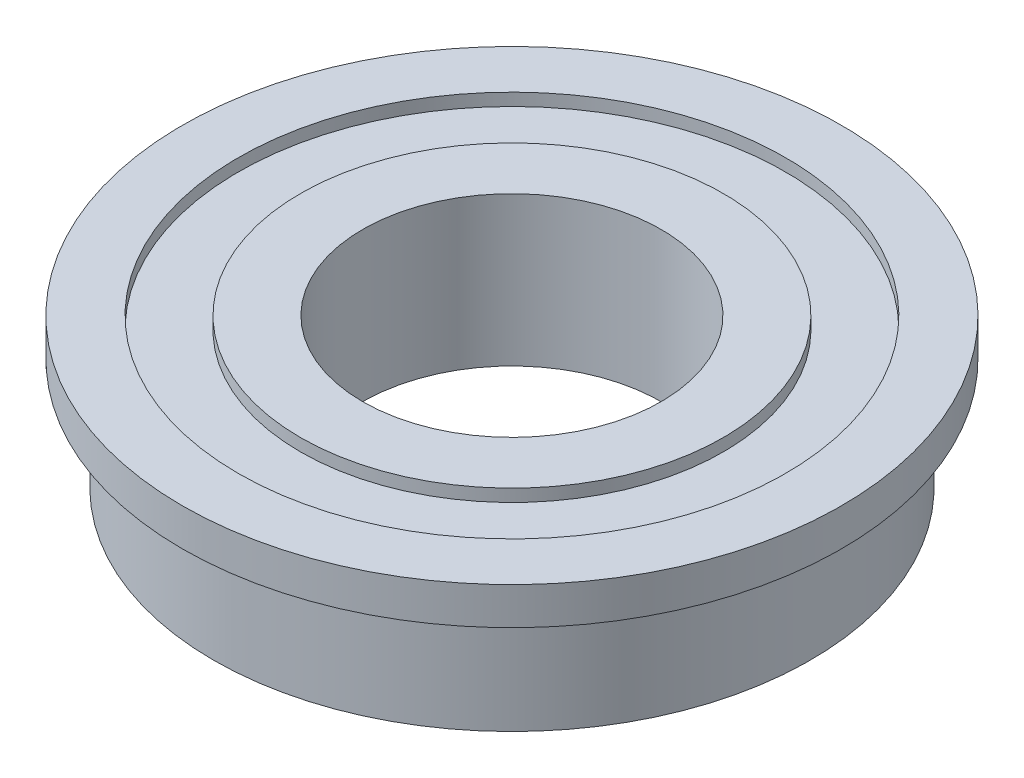
ISO-10303-21;
HEADER;
FILE_DESCRIPTION(('STEP AP214'),'2;1');
FILE_NAME('part.step','',(''),(''),'','','');
FILE_SCHEMA(('AUTOMOTIVE_DESIGN { 1 0 10303 214 1 1 1 1 }'));
ENDSEC;
DATA;
#1=APPLICATION_CONTEXT('core data for automotive mechanical design processes');
#2=APPLICATION_PROTOCOL_DEFINITION('international standard','automotive_design',2000,#1);
#3=PRODUCT_CONTEXT('',#1,'mechanical');
#4=PRODUCT('Part','Part','',(#3));
#5=PRODUCT_RELATED_PRODUCT_CATEGORY('part','',(#4));
#6=PRODUCT_DEFINITION_FORMATION('','',#4);
#7=PRODUCT_DEFINITION_CONTEXT('part definition',#1,'design');
#8=PRODUCT_DEFINITION('design','',#6,#7);
#9=PRODUCT_DEFINITION_SHAPE('','',#8);
#10=(LENGTH_UNIT() NAMED_UNIT(*) SI_UNIT(.MILLI.,.METRE.));
#11=(NAMED_UNIT(*) PLANE_ANGLE_UNIT() SI_UNIT($,.RADIAN.));
#12=(NAMED_UNIT(*) SI_UNIT($,.STERADIAN.) SOLID_ANGLE_UNIT());
#13=UNCERTAINTY_MEASURE_WITH_UNIT(LENGTH_MEASURE(1.E-05),#10,'distance_accuracy_value','');
#14=(GEOMETRIC_REPRESENTATION_CONTEXT(3) GLOBAL_UNCERTAINTY_ASSIGNED_CONTEXT((#13)) GLOBAL_UNIT_ASSIGNED_CONTEXT((#10,
#11,#12)) REPRESENTATION_CONTEXT('',''));
#15=CARTESIAN_POINT('',(0.,0.,0.));
#16=DIRECTION('',(0.,0.,1.));
#17=DIRECTION('',(1.,0.,0.));
#18=AXIS2_PLACEMENT_3D('',#15,#16,#17);
#19=CARTESIAN_POINT('',(0.,-6.,0.));
#20=DIRECTION('',(0.,1.,0.));
#21=DIRECTION('',(0.,0.,1.));
#22=AXIS2_PLACEMENT_3D('',#19,#20,#21);
#23=PLANE('',#22);
#24=CARTESIAN_POINT('',(0.,-6.,0.));
#25=DIRECTION('',(0.,1.,0.));
#26=DIRECTION('',(0.,0.,1.));
#27=AXIS2_PLACEMENT_3D('',#24,#25,#26);
#28=CIRCLE('',#27,6.);
#29=CARTESIAN_POINT('',(0.,-6.,6.));
#30=VERTEX_POINT('',#29);
#31=EDGE_CURVE('E48',#30,#30,#28,.T.);
#32=ORIENTED_EDGE('',*,*,#31,.T.);
#33=EDGE_LOOP('',(#32));
#34=FACE_BOUND('',#33,.T.);
#35=CARTESIAN_POINT('',(0.,-6.,0.));
#36=DIRECTION('',(0.,-1.,0.));
#37=DIRECTION('',(0.,0.,-1.));
#38=AXIS2_PLACEMENT_3D('',#35,#36,#37);
#39=CIRCLE('',#38,8.5);
#40=CARTESIAN_POINT('',(0.,-6.,-8.5));
#41=VERTEX_POINT('',#40);
#42=EDGE_CURVE('E82',#41,#41,#39,.T.);
#43=ORIENTED_EDGE('',*,*,#42,.T.);
#44=EDGE_LOOP('',(#43));
#45=FACE_BOUND('',#44,.T.);
#46=ADVANCED_FACE('F40',(#34,#45),#23,.F.);
#47=CARTESIAN_POINT('',(0.,0.,0.));
#48=DIRECTION('',(0.,1.,0.));
#49=DIRECTION('',(0.,0.,1.));
#50=AXIS2_PLACEMENT_3D('',#47,#48,#49);
#51=PLANE('',#50);
#52=CARTESIAN_POINT('',(0.,0.,0.));
#53=DIRECTION('',(0.,1.,0.));
#54=DIRECTION('',(0.,0.,1.));
#55=AXIS2_PLACEMENT_3D('',#52,#53,#54);
#56=CIRCLE('',#55,6.);
#57=CARTESIAN_POINT('',(0.,0.,6.));
#58=VERTEX_POINT('',#57);
#59=EDGE_CURVE('E44',#58,#58,#56,.T.);
#60=ORIENTED_EDGE('',*,*,#59,.F.);
#61=EDGE_LOOP('',(#60));
#62=FACE_BOUND('',#61,.T.);
#63=CARTESIAN_POINT('',(0.,0.,0.));
#64=DIRECTION('',(0.,1.,0.));
#65=DIRECTION('',(0.,0.,1.));
#66=AXIS2_PLACEMENT_3D('',#63,#64,#65);
#67=CIRCLE('',#66,8.5);
#68=CARTESIAN_POINT('',(0.,0.,8.5));
#69=VERTEX_POINT('',#68);
#70=EDGE_CURVE('E70',#69,#69,#67,.T.);
#71=ORIENTED_EDGE('',*,*,#70,.T.);
#72=EDGE_LOOP('',(#71));
#73=FACE_BOUND('',#72,.T.);
#74=ADVANCED_FACE('F116',(#62,#73),#51,.T.);
#75=CARTESIAN_POINT('',(0.,-6.,0.));
#76=DIRECTION('',(0.,1.,0.));
#77=DIRECTION('',(0.,0.,1.));
#78=AXIS2_PLACEMENT_3D('',#75,#76,#77);
#79=CYLINDRICAL_SURFACE('',#78,12.);
#80=CARTESIAN_POINT('',(0.,-6.,0.));
#81=DIRECTION('',(0.,1.,0.));
#82=DIRECTION('',(0.,0.,1.));
#83=AXIS2_PLACEMENT_3D('',#80,#81,#82);
#84=CIRCLE('',#83,12.);
#85=CARTESIAN_POINT('',(0.,-6.,12.));
#86=VERTEX_POINT('',#85);
#87=EDGE_CURVE('E10',#86,#86,#84,.T.);
#88=ORIENTED_EDGE('',*,*,#87,.T.);
#89=EDGE_LOOP('',(#88));
#90=FACE_BOUND('',#89,.T.);
#91=CARTESIAN_POINT('',(0.,-1.5,0.));
#92=DIRECTION('',(0.,1.,0.));
#93=DIRECTION('',(0.,0.,1.));
#94=AXIS2_PLACEMENT_3D('',#91,#92,#93);
#95=CIRCLE('',#94,12.);
#96=CARTESIAN_POINT('',(0.,-1.5,12.));
#97=VERTEX_POINT('',#96);
#98=EDGE_CURVE('E57',#97,#97,#95,.T.);
#99=ORIENTED_EDGE('',*,*,#98,.F.);
#100=EDGE_LOOP('',(#99));
#101=FACE_BOUND('',#100,.T.);
#102=ADVANCED_FACE('F117',(#90,#101),#79,.T.);
#103=CARTESIAN_POINT('',(0.,-6.,0.));
#104=DIRECTION('',(0.,1.,0.));
#105=DIRECTION('',(0.,0.,1.));
#106=AXIS2_PLACEMENT_3D('',#103,#104,#105);
#107=CYLINDRICAL_SURFACE('',#106,6.);
#108=ORIENTED_EDGE('',*,*,#31,.F.);
#109=EDGE_LOOP('',(#108));
#110=FACE_BOUND('',#109,.T.);
#111=ORIENTED_EDGE('',*,*,#59,.T.);
#112=EDGE_LOOP('',(#111));
#113=FACE_BOUND('',#112,.T.);
#114=ADVANCED_FACE('F42',(#110,#113),#107,.F.);
#115=CARTESIAN_POINT('',(0.,-6.,0.));
#116=DIRECTION('',(0.,-1.,0.));
#117=DIRECTION('',(0.,0.,-1.));
#118=AXIS2_PLACEMENT_3D('',#115,#116,#117);
#119=CIRCLE('',#118,11.);
#120=CARTESIAN_POINT('',(0.,-6.,-11.));
#121=VERTEX_POINT('',#120);
#122=EDGE_CURVE('E76',#121,#121,#119,.T.);
#123=ORIENTED_EDGE('',*,*,#122,.F.);
#124=EDGE_LOOP('',(#123));
#125=FACE_BOUND('',#124,.T.);
#126=ORIENTED_EDGE('',*,*,#87,.F.);
#127=EDGE_LOOP('',(#126));
#128=FACE_BOUND('',#127,.T.);
#129=ADVANCED_FACE('F104',(#125,#128),#23,.F.);
#130=CARTESIAN_POINT('',(0.,0.,0.));
#131=DIRECTION('',(0.,1.,0.));
#132=DIRECTION('',(0.,0.,1.));
#133=AXIS2_PLACEMENT_3D('',#130,#131,#132);
#134=CIRCLE('',#133,11.);
#135=CARTESIAN_POINT('',(0.,0.,11.));
#136=VERTEX_POINT('',#135);
#137=EDGE_CURVE('E64',#136,#136,#134,.T.);
#138=ORIENTED_EDGE('',*,*,#137,.F.);
#139=EDGE_LOOP('',(#138));
#140=FACE_BOUND('',#139,.T.);
#141=CARTESIAN_POINT('',(0.,0.,0.));
#142=DIRECTION('',(0.,1.,0.));
#143=DIRECTION('',(0.,0.,1.));
#144=AXIS2_PLACEMENT_3D('',#141,#142,#143);
#145=CIRCLE('',#144,13.25);
#146=CARTESIAN_POINT('',(0.,0.,13.25));
#147=VERTEX_POINT('',#146);
#148=EDGE_CURVE('E54',#147,#147,#145,.T.);
#149=ORIENTED_EDGE('',*,*,#148,.T.);
#150=EDGE_LOOP('',(#149));
#151=FACE_BOUND('',#150,.T.);
#152=ADVANCED_FACE('F107',(#140,#151),#51,.T.);
#153=CARTESIAN_POINT('',(0.,-1.5,0.));
#154=DIRECTION('',(0.,1.,0.));
#155=DIRECTION('',(0.,0.,1.));
#156=AXIS2_PLACEMENT_3D('',#153,#154,#155);
#157=CYLINDRICAL_SURFACE('',#156,13.25);
#158=CARTESIAN_POINT('',(0.,-1.5,0.));
#159=DIRECTION('',(0.,1.,0.));
#160=DIRECTION('',(0.,0.,1.));
#161=AXIS2_PLACEMENT_3D('',#158,#159,#160);
#162=CIRCLE('',#161,13.25);
#163=CARTESIAN_POINT('',(0.,-1.5,13.25));
#164=VERTEX_POINT('',#163);
#165=EDGE_CURVE('E59',#164,#164,#162,.T.);
#166=ORIENTED_EDGE('',*,*,#165,.T.);
#167=EDGE_LOOP('',(#166));
#168=FACE_BOUND('',#167,.T.);
#169=ORIENTED_EDGE('',*,*,#148,.F.);
#170=EDGE_LOOP('',(#169));
#171=FACE_BOUND('',#170,.T.);
#172=ADVANCED_FACE('F113',(#168,#171),#157,.T.);
#173=CARTESIAN_POINT('',(0.,-1.5,0.));
#174=DIRECTION('',(0.,1.,0.));
#175=DIRECTION('',(0.,0.,1.));
#176=AXIS2_PLACEMENT_3D('',#173,#174,#175);
#177=PLANE('',#176);
#178=ORIENTED_EDGE('',*,*,#98,.T.);
#179=EDGE_LOOP('',(#178));
#180=FACE_BOUND('',#179,.T.);
#181=ORIENTED_EDGE('',*,*,#165,.F.);
#182=EDGE_LOOP('',(#181));
#183=FACE_BOUND('',#182,.T.);
#184=ADVANCED_FACE('F144',(#180,#183),#177,.F.);
#185=CARTESIAN_POINT('',(0.,-0.5,0.));
#186=DIRECTION('',(0.,1.,0.));
#187=DIRECTION('',(0.,0.,1.));
#188=AXIS2_PLACEMENT_3D('',#185,#186,#187);
#189=CYLINDRICAL_SURFACE('',#188,11.);
#190=CARTESIAN_POINT('',(0.,-0.5,0.));
#191=DIRECTION('',(0.,1.,0.));
#192=DIRECTION('',(0.,0.,1.));
#193=AXIS2_PLACEMENT_3D('',#190,#191,#192);
#194=CIRCLE('',#193,11.);
#195=CARTESIAN_POINT('',(0.,-0.5,11.));
#196=VERTEX_POINT('',#195);
#197=EDGE_CURVE('E58',#196,#196,#194,.T.);
#198=ORIENTED_EDGE('',*,*,#197,.F.);
#199=EDGE_LOOP('',(#198));
#200=FACE_BOUND('',#199,.T.);
#201=ORIENTED_EDGE('',*,*,#137,.T.);
#202=EDGE_LOOP('',(#201));
#203=FACE_BOUND('',#202,.T.);
#204=ADVANCED_FACE('F140',(#200,#203),#189,.F.);
#205=CARTESIAN_POINT('',(0.,-0.5,0.));
#206=DIRECTION('',(0.,1.,0.));
#207=DIRECTION('',(0.,0.,1.));
#208=AXIS2_PLACEMENT_3D('',#205,#206,#207);
#209=PLANE('',#208);
#210=CARTESIAN_POINT('',(0.,-0.5,0.));
#211=DIRECTION('',(0.,1.,0.));
#212=DIRECTION('',(0.,0.,1.));
#213=AXIS2_PLACEMENT_3D('',#210,#211,#212);
#214=CIRCLE('',#213,8.5);
#215=CARTESIAN_POINT('',(0.,-0.5,8.5));
#216=VERTEX_POINT('',#215);
#217=EDGE_CURVE('E67',#216,#216,#214,.T.);
#218=ORIENTED_EDGE('',*,*,#217,.F.);
#219=EDGE_LOOP('',(#218));
#220=FACE_BOUND('',#219,.T.);
#221=ORIENTED_EDGE('',*,*,#197,.T.);
#222=EDGE_LOOP('',(#221));
#223=FACE_BOUND('',#222,.T.);
#224=ADVANCED_FACE('F136',(#220,#223),#209,.T.);
#225=CARTESIAN_POINT('',(0.,-0.5,0.));
#226=DIRECTION('',(0.,1.,0.));
#227=DIRECTION('',(0.,0.,1.));
#228=AXIS2_PLACEMENT_3D('',#225,#226,#227);
#229=CYLINDRICAL_SURFACE('',#228,8.5);
#230=ORIENTED_EDGE('',*,*,#217,.T.);
#231=EDGE_LOOP('',(#230));
#232=FACE_BOUND('',#231,.T.);
#233=ORIENTED_EDGE('',*,*,#70,.F.);
#234=EDGE_LOOP('',(#233));
#235=FACE_BOUND('',#234,.T.);
#236=ADVANCED_FACE('F100',(#232,#235),#229,.T.);
#237=CARTESIAN_POINT('',(0.,-5.5,0.));
#238=DIRECTION('',(0.,-1.,0.));
#239=DIRECTION('',(0.,0.,-1.));
#240=AXIS2_PLACEMENT_3D('',#237,#238,#239);
#241=CYLINDRICAL_SURFACE('',#240,11.);
#242=CARTESIAN_POINT('',(0.,-5.5,0.));
#243=DIRECTION('',(0.,-1.,0.));
#244=DIRECTION('',(0.,0.,-1.));
#245=AXIS2_PLACEMENT_3D('',#242,#243,#244);
#246=CIRCLE('',#245,11.);
#247=CARTESIAN_POINT('',(0.,-5.5,-11.));
#248=VERTEX_POINT('',#247);
#249=EDGE_CURVE('E73',#248,#248,#246,.T.);
#250=ORIENTED_EDGE('',*,*,#249,.F.);
#251=EDGE_LOOP('',(#250));
#252=FACE_BOUND('',#251,.T.);
#253=ORIENTED_EDGE('',*,*,#122,.T.);
#254=EDGE_LOOP('',(#253));
#255=FACE_BOUND('',#254,.T.);
#256=ADVANCED_FACE('F94',(#252,#255),#241,.F.);
#257=CARTESIAN_POINT('',(0.,-5.5,0.));
#258=DIRECTION('',(0.,-1.,0.));
#259=DIRECTION('',(0.,0.,-1.));
#260=AXIS2_PLACEMENT_3D('',#257,#258,#259);
#261=PLANE('',#260);
#262=CARTESIAN_POINT('',(0.,-5.5,0.));
#263=DIRECTION('',(0.,-1.,0.));
#264=DIRECTION('',(0.,0.,-1.));
#265=AXIS2_PLACEMENT_3D('',#262,#263,#264);
#266=CIRCLE('',#265,8.5);
#267=CARTESIAN_POINT('',(0.,-5.5,-8.5));
#268=VERTEX_POINT('',#267);
#269=EDGE_CURVE('E79',#268,#268,#266,.T.);
#270=ORIENTED_EDGE('',*,*,#269,.F.);
#271=EDGE_LOOP('',(#270));
#272=FACE_BOUND('',#271,.T.);
#273=ORIENTED_EDGE('',*,*,#249,.T.);
#274=EDGE_LOOP('',(#273));
#275=FACE_BOUND('',#274,.T.);
#276=ADVANCED_FACE('F91',(#272,#275),#261,.T.);
#277=CARTESIAN_POINT('',(0.,-5.5,0.));
#278=DIRECTION('',(0.,-1.,0.));
#279=DIRECTION('',(0.,0.,-1.));
#280=AXIS2_PLACEMENT_3D('',#277,#278,#279);
#281=CYLINDRICAL_SURFACE('',#280,8.5);
#282=ORIENTED_EDGE('',*,*,#269,.T.);
#283=EDGE_LOOP('',(#282));
#284=FACE_BOUND('',#283,.T.);
#285=ORIENTED_EDGE('',*,*,#42,.F.);
#286=EDGE_LOOP('',(#285));
#287=FACE_BOUND('',#286,.T.);
#288=ADVANCED_FACE('F88',(#284,#287),#281,.T.);
#289=CLOSED_SHELL('',(#46,#74,#102,#114,#129,#152,#172,#184,#204,#224,#236,#256,#276,#288));
#290=MANIFOLD_SOLID_BREP('B2',#289);
#291=ADVANCED_BREP_SHAPE_REPRESENTATION('',(#18,#290),#14);
#292=SHAPE_DEFINITION_REPRESENTATION(#9,#291);
ENDSEC;
END-ISO-10303-21;
